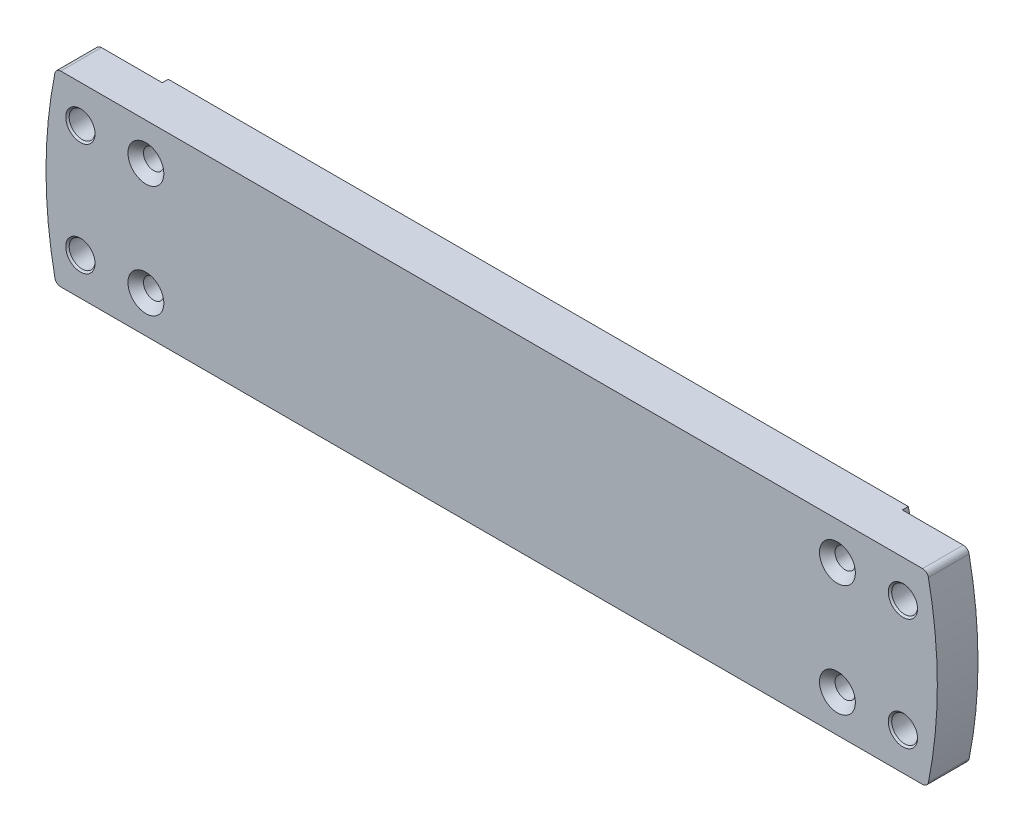
ISO-10303-21;
HEADER;
FILE_DESCRIPTION(('STEP AP214'),'2;1');
FILE_NAME('part.step','',(''),(''),'','','');
FILE_SCHEMA(('AUTOMOTIVE_DESIGN { 1 0 10303 214 1 1 1 1 }'));
ENDSEC;
DATA;
#1=APPLICATION_CONTEXT('core data for automotive mechanical design processes');
#2=APPLICATION_PROTOCOL_DEFINITION('international standard','automotive_design',2000,#1);
#3=PRODUCT_CONTEXT('',#1,'mechanical');
#4=PRODUCT('Part','Part','',(#3));
#5=PRODUCT_RELATED_PRODUCT_CATEGORY('part','',(#4));
#6=PRODUCT_DEFINITION_FORMATION('','',#4);
#7=PRODUCT_DEFINITION_CONTEXT('part definition',#1,'design');
#8=PRODUCT_DEFINITION('design','',#6,#7);
#9=PRODUCT_DEFINITION_SHAPE('','',#8);
#10=(LENGTH_UNIT() NAMED_UNIT(*) SI_UNIT(.MILLI.,.METRE.));
#11=(NAMED_UNIT(*) PLANE_ANGLE_UNIT() SI_UNIT($,.RADIAN.));
#12=(NAMED_UNIT(*) SI_UNIT($,.STERADIAN.) SOLID_ANGLE_UNIT());
#13=UNCERTAINTY_MEASURE_WITH_UNIT(LENGTH_MEASURE(1.E-05),#10,'distance_accuracy_value','');
#14=(GEOMETRIC_REPRESENTATION_CONTEXT(3) GLOBAL_UNCERTAINTY_ASSIGNED_CONTEXT((#13)) GLOBAL_UNIT_ASSIGNED_CONTEXT((#10,
#11,#12)) REPRESENTATION_CONTEXT('',''));
#15=CARTESIAN_POINT('',(0.,0.,0.));
#16=DIRECTION('',(0.,0.,1.));
#17=DIRECTION('',(1.,0.,0.));
#18=AXIS2_PLACEMENT_3D('',#15,#16,#17);
#19=CARTESIAN_POINT('',(0.,0.,7.9248));
#20=DIRECTION('',(0.,0.,-1.));
#21=DIRECTION('',(-1.,0.,0.));
#22=AXIS2_PLACEMENT_3D('',#19,#20,#21);
#23=CYLINDRICAL_SURFACE('',#22,75.692);
#24=CARTESIAN_POINT('',(0.,0.,1.016));
#25=DIRECTION('',(0.,0.,1.));
#26=DIRECTION('',(1.,0.,0.));
#27=AXIS2_PLACEMENT_3D('',#24,#25,#26);
#28=CIRCLE('',#27,75.692);
#29=CARTESIAN_POINT('',(74.1784350407569,15.0611632653061,1.016));
#30=VERTEX_POINT('',#29);
#31=CARTESIAN_POINT('',(74.1784350407569,-15.0611632653061,1.016));
#32=VERTEX_POINT('',#31);
#33=EDGE_CURVE('E157',#30,#32,#28,.F.);
#34=ORIENTED_EDGE('',*,*,#33,.F.);
#35=DIRECTION('',(0.,0.,-1.));
#36=VECTOR('',#35,1.);
#37=CARTESIAN_POINT('',(74.1784350407569,15.0611632653061,7.9248));
#38=LINE('',#37,#36);
#39=CARTESIAN_POINT('',(74.1784350407569,15.0611632653061,7.9248));
#40=VERTEX_POINT('',#39);
#41=EDGE_CURVE('E11',#30,#40,#38,.F.);
#42=ORIENTED_EDGE('',*,*,#41,.T.);
#43=CARTESIAN_POINT('',(0.,0.,7.9248));
#44=DIRECTION('',(0.,0.,-1.));
#45=DIRECTION('',(1.,0.,0.));
#46=AXIS2_PLACEMENT_3D('',#43,#44,#45);
#47=CIRCLE('',#46,75.692);
#48=CARTESIAN_POINT('',(74.1784350407569,-15.0611632653061,7.9248));
#49=VERTEX_POINT('',#48);
#50=EDGE_CURVE('E352',#40,#49,#47,.T.);
#51=ORIENTED_EDGE('',*,*,#50,.T.);
#52=DIRECTION('',(0.,0.,-1.));
#53=VECTOR('',#52,1.);
#54=CARTESIAN_POINT('',(74.1784350407569,-15.0611632653061,7.9248));
#55=LINE('',#54,#53);
#56=EDGE_CURVE('E46',#49,#32,#55,.T.);
#57=ORIENTED_EDGE('',*,*,#56,.T.);
#58=EDGE_LOOP('',(#34,#42,#51,#57));
#59=FACE_BOUND('',#58,.T.);
#60=ADVANCED_FACE('F38',(#59),#23,.T.);
#61=CARTESIAN_POINT('',(74.0085349064552,15.875,7.9248));
#62=DIRECTION('',(0.,1.,0.));
#63=DIRECTION('',(0.,0.,1.));
#64=AXIS2_PLACEMENT_3D('',#61,#62,#63);
#65=PLANE('',#64);
#66=DIRECTION('',(1.,0.,0.));
#67=VECTOR('',#66,1.);
#68=CARTESIAN_POINT('',(74.0085349064552,15.875,1.016));
#69=LINE('',#68,#67);
#70=CARTESIAN_POINT('',(-73.1827513489346,15.875,1.016));
#71=VERTEX_POINT('',#70);
#72=CARTESIAN_POINT('',(-62.8468017296027,15.875,1.016));
#73=VERTEX_POINT('',#72);
#74=EDGE_CURVE('E159',#71,#73,#69,.T.);
#75=ORIENTED_EDGE('',*,*,#74,.F.);
#76=DIRECTION('',(0.,0.,-1.));
#77=VECTOR('',#76,1.);
#78=CARTESIAN_POINT('',(-73.1827513489346,15.875,7.9248));
#79=LINE('',#78,#77);
#80=CARTESIAN_POINT('',(-73.1827513489346,15.875,7.9248));
#81=VERTEX_POINT('',#80);
#82=EDGE_CURVE('E332',#71,#81,#79,.F.);
#83=ORIENTED_EDGE('',*,*,#82,.T.);
#84=DIRECTION('',(1.,0.,0.));
#85=VECTOR('',#84,1.);
#86=CARTESIAN_POINT('',(74.0085349064552,15.875,7.9248));
#87=LINE('',#86,#85);
#88=CARTESIAN_POINT('',(73.1827513489346,15.875,7.9248));
#89=VERTEX_POINT('',#88);
#90=EDGE_CURVE('E318',#81,#89,#87,.T.);
#91=ORIENTED_EDGE('',*,*,#90,.T.);
#92=DIRECTION('',(0.,0.,-1.));
#93=VECTOR('',#92,1.);
#94=CARTESIAN_POINT('',(73.1827513489346,15.875,7.9248));
#95=LINE('',#94,#93);
#96=CARTESIAN_POINT('',(73.1827513489346,15.875,1.016));
#97=VERTEX_POINT('',#96);
#98=EDGE_CURVE('E155',#89,#97,#95,.T.);
#99=ORIENTED_EDGE('',*,*,#98,.T.);
#100=CARTESIAN_POINT('',(62.8468017296027,15.875,1.016));
#101=VERTEX_POINT('',#100);
#102=EDGE_CURVE('E143',#101,#97,#69,.T.);
#103=ORIENTED_EDGE('',*,*,#102,.F.);
#104=DIRECTION('',(0.,0.,1.));
#105=VECTOR('',#104,1.);
#106=CARTESIAN_POINT('',(62.8468017296027,15.875,-12.484857720608));
#107=LINE('',#106,#105);
#108=CARTESIAN_POINT('',(62.8468017296027,15.875,0.));
#109=VERTEX_POINT('',#108);
#110=EDGE_CURVE('E128',#109,#101,#107,.T.);
#111=ORIENTED_EDGE('',*,*,#110,.F.);
#112=DIRECTION('',(1.,0.,0.));
#113=VECTOR('',#112,1.);
#114=CARTESIAN_POINT('',(74.0085349064552,15.875,0.));
#115=LINE('',#114,#113);
#116=CARTESIAN_POINT('',(-62.8468017296027,15.875,0.));
#117=VERTEX_POINT('',#116);
#118=EDGE_CURVE('E161',#117,#109,#115,.T.);
#119=ORIENTED_EDGE('',*,*,#118,.F.);
#120=DIRECTION('',(0.,0.,1.));
#121=VECTOR('',#120,1.);
#122=CARTESIAN_POINT('',(-62.8468017296027,15.875,-12.484857720608));
#123=LINE('',#122,#121);
#124=EDGE_CURVE('E170',#73,#117,#123,.F.);
#125=ORIENTED_EDGE('',*,*,#124,.F.);
#126=EDGE_LOOP('',(#75,#83,#91,#99,#103,#111,#119,#125));
#127=FACE_BOUND('',#126,.T.);
#128=ADVANCED_FACE('F152',(#127),#65,.T.);
#129=CARTESIAN_POINT('',(0.,0.,7.9248));
#130=DIRECTION('',(0.,0.,-1.));
#131=DIRECTION('',(-1.,0.,0.));
#132=AXIS2_PLACEMENT_3D('',#129,#130,#131);
#133=CYLINDRICAL_SURFACE('',#132,75.692);
#134=CARTESIAN_POINT('',(0.,0.,7.9248));
#135=DIRECTION('',(0.,0.,-1.));
#136=DIRECTION('',(-1.,0.,0.));
#137=AXIS2_PLACEMENT_3D('',#134,#135,#136);
#138=CIRCLE('',#137,75.692);
#139=CARTESIAN_POINT('',(-74.1784350407569,-15.0611632653061,7.9248));
#140=VERTEX_POINT('',#139);
#141=CARTESIAN_POINT('',(-74.1784350407569,15.0611632653061,7.9248));
#142=VERTEX_POINT('',#141);
#143=EDGE_CURVE('E326',#140,#142,#138,.T.);
#144=ORIENTED_EDGE('',*,*,#143,.T.);
#145=DIRECTION('',(0.,0.,-1.));
#146=VECTOR('',#145,1.);
#147=CARTESIAN_POINT('',(-74.1784350407569,15.0611632653061,7.9248));
#148=LINE('',#147,#146);
#149=CARTESIAN_POINT('',(-74.1784350407569,15.0611632653061,1.016));
#150=VERTEX_POINT('',#149);
#151=EDGE_CURVE('E334',#142,#150,#148,.T.);
#152=ORIENTED_EDGE('',*,*,#151,.T.);
#153=CARTESIAN_POINT('',(0.,0.,1.016));
#154=DIRECTION('',(0.,0.,1.));
#155=DIRECTION('',(1.,0.,0.));
#156=AXIS2_PLACEMENT_3D('',#153,#154,#155);
#157=CIRCLE('',#156,75.692);
#158=CARTESIAN_POINT('',(-74.1784350407569,-15.0611632653061,1.016));
#159=VERTEX_POINT('',#158);
#160=EDGE_CURVE('E165',#159,#150,#157,.F.);
#161=ORIENTED_EDGE('',*,*,#160,.F.);
#162=DIRECTION('',(0.,0.,-1.));
#163=VECTOR('',#162,1.);
#164=CARTESIAN_POINT('',(-74.1784350407569,-15.0611632653061,7.9248));
#165=LINE('',#164,#163);
#166=EDGE_CURVE('E358',#159,#140,#165,.F.);
#167=ORIENTED_EDGE('',*,*,#166,.T.);
#168=EDGE_LOOP('',(#144,#152,#161,#167));
#169=FACE_BOUND('',#168,.T.);
#170=ADVANCED_FACE('F443',(#169),#133,.T.);
#171=CARTESIAN_POINT('',(74.0085349064552,-15.875,7.9248));
#172=DIRECTION('',(0.,-1.,0.));
#173=DIRECTION('',(0.,0.,-1.));
#174=AXIS2_PLACEMENT_3D('',#171,#172,#173);
#175=PLANE('',#174);
#176=DIRECTION('',(-1.,0.,0.));
#177=VECTOR('',#176,1.);
#178=CARTESIAN_POINT('',(74.0085349064552,-15.875,7.9248));
#179=LINE('',#178,#177);
#180=CARTESIAN_POINT('',(73.1827513489346,-15.875,7.9248));
#181=VERTEX_POINT('',#180);
#182=CARTESIAN_POINT('',(-73.1827513489346,-15.875,7.9248));
#183=VERTEX_POINT('',#182);
#184=EDGE_CURVE('E384',#181,#183,#179,.T.);
#185=ORIENTED_EDGE('',*,*,#184,.T.);
#186=DIRECTION('',(0.,0.,-1.));
#187=VECTOR('',#186,1.);
#188=CARTESIAN_POINT('',(-73.1827513489346,-15.875,7.9248));
#189=LINE('',#188,#187);
#190=CARTESIAN_POINT('',(-73.1827513489346,-15.875,1.016));
#191=VERTEX_POINT('',#190);
#192=EDGE_CURVE('E341',#183,#191,#189,.T.);
#193=ORIENTED_EDGE('',*,*,#192,.T.);
#194=DIRECTION('',(-1.,0.,0.));
#195=VECTOR('',#194,1.);
#196=CARTESIAN_POINT('',(74.0085349064552,-15.875,1.016));
#197=LINE('',#196,#195);
#198=CARTESIAN_POINT('',(-62.8468017296028,-15.875,1.016));
#199=VERTEX_POINT('',#198);
#200=EDGE_CURVE('E359',#199,#191,#197,.T.);
#201=ORIENTED_EDGE('',*,*,#200,.F.);
#202=DIRECTION('',(0.,0.,1.));
#203=VECTOR('',#202,1.);
#204=CARTESIAN_POINT('',(-62.8468017296028,-15.875,-12.484857720608));
#205=LINE('',#204,#203);
#206=CARTESIAN_POINT('',(-62.8468017296028,-15.875,0.));
#207=VERTEX_POINT('',#206);
#208=EDGE_CURVE('E139',#207,#199,#205,.T.);
#209=ORIENTED_EDGE('',*,*,#208,.F.);
#210=DIRECTION('',(-1.,0.,0.));
#211=VECTOR('',#210,1.);
#212=CARTESIAN_POINT('',(74.0085349064552,-15.875,0.));
#213=LINE('',#212,#211);
#214=CARTESIAN_POINT('',(62.8468017296028,-15.875,0.));
#215=VERTEX_POINT('',#214);
#216=EDGE_CURVE('E156',#215,#207,#213,.T.);
#217=ORIENTED_EDGE('',*,*,#216,.F.);
#218=DIRECTION('',(0.,0.,1.));
#219=VECTOR('',#218,1.);
#220=CARTESIAN_POINT('',(62.8468017296028,-15.875,-12.484857720608));
#221=LINE('',#220,#219);
#222=CARTESIAN_POINT('',(62.8468017296028,-15.875,1.016));
#223=VERTEX_POINT('',#222);
#224=EDGE_CURVE('E140',#223,#215,#221,.F.);
#225=ORIENTED_EDGE('',*,*,#224,.F.);
#226=CARTESIAN_POINT('',(73.1827513489346,-15.875,1.016));
#227=VERTEX_POINT('',#226);
#228=EDGE_CURVE('E145',#227,#223,#197,.T.);
#229=ORIENTED_EDGE('',*,*,#228,.F.);
#230=DIRECTION('',(0.,0.,-1.));
#231=VECTOR('',#230,1.);
#232=CARTESIAN_POINT('',(73.1827513489346,-15.875,7.9248));
#233=LINE('',#232,#231);
#234=EDGE_CURVE('E336',#227,#181,#233,.F.);
#235=ORIENTED_EDGE('',*,*,#234,.T.);
#236=EDGE_LOOP('',(#185,#193,#201,#209,#217,#225,#229,#235));
#237=FACE_BOUND('',#236,.T.);
#238=ADVANCED_FACE('F301',(#237),#175,.T.);
#239=CARTESIAN_POINT('',(0.,0.,7.9248));
#240=DIRECTION('',(0.,0.,1.));
#241=DIRECTION('',(1.,0.,0.));
#242=AXIS2_PLACEMENT_3D('',#239,#240,#241);
#243=PLANE('',#242);
#244=CARTESIAN_POINT('',(69.85,9.525,7.9248));
#245=DIRECTION('',(0.,0.,1.));
#246=DIRECTION('',(1.,0.,0.));
#247=AXIS2_PLACEMENT_3D('',#244,#245,#246);
#248=CIRCLE('',#247,2.4892);
#249=CARTESIAN_POINT('',(72.3392,9.525,7.9248));
#250=VERTEX_POINT('',#249);
#251=EDGE_CURVE('E269',#250,#250,#248,.T.);
#252=ORIENTED_EDGE('',*,*,#251,.F.);
#253=EDGE_LOOP('',(#252));
#254=FACE_BOUND('',#253,.T.);
#255=CARTESIAN_POINT('',(69.85,-9.525,7.9248));
#256=DIRECTION('',(0.,0.,1.));
#257=DIRECTION('',(1.,0.,0.));
#258=AXIS2_PLACEMENT_3D('',#255,#256,#257);
#259=CIRCLE('',#258,2.4892);
#260=CARTESIAN_POINT('',(72.3392,-9.525,7.9248));
#261=VERTEX_POINT('',#260);
#262=EDGE_CURVE('E257',#261,#261,#259,.T.);
#263=ORIENTED_EDGE('',*,*,#262,.F.);
#264=EDGE_LOOP('',(#263));
#265=FACE_BOUND('',#264,.T.);
#266=CARTESIAN_POINT('',(-69.85,9.525,7.9248));
#267=DIRECTION('',(0.,0.,1.));
#268=DIRECTION('',(1.,0.,0.));
#269=AXIS2_PLACEMENT_3D('',#266,#267,#268);
#270=CIRCLE('',#269,2.4892);
#271=CARTESIAN_POINT('',(-67.3608,9.525,7.9248));
#272=VERTEX_POINT('',#271);
#273=EDGE_CURVE('E245',#272,#272,#270,.T.);
#274=ORIENTED_EDGE('',*,*,#273,.F.);
#275=EDGE_LOOP('',(#274));
#276=FACE_BOUND('',#275,.T.);
#277=CARTESIAN_POINT('',(-69.85,-9.525,7.9248));
#278=DIRECTION('',(0.,0.,1.));
#279=DIRECTION('',(1.,0.,0.));
#280=AXIS2_PLACEMENT_3D('',#277,#278,#279);
#281=CIRCLE('',#280,2.4892);
#282=CARTESIAN_POINT('',(-67.3608,-9.525,7.9248));
#283=VERTEX_POINT('',#282);
#284=EDGE_CURVE('E233',#283,#283,#281,.T.);
#285=ORIENTED_EDGE('',*,*,#284,.F.);
#286=EDGE_LOOP('',(#285));
#287=FACE_BOUND('',#286,.T.);
#288=CARTESIAN_POINT('',(-58.7248,9.525,7.9248));
#289=DIRECTION('',(0.,0.,-1.));
#290=DIRECTION('',(-1.,0.,0.));
#291=AXIS2_PLACEMENT_3D('',#288,#289,#290);
#292=CIRCLE('',#291,3.048);
#293=CARTESIAN_POINT('',(-61.7728,9.525,7.9248));
#294=VERTEX_POINT('',#293);
#295=EDGE_CURVE('E224',#294,#294,#292,.T.);
#296=ORIENTED_EDGE('',*,*,#295,.T.);
#297=EDGE_LOOP('',(#296));
#298=FACE_BOUND('',#297,.T.);
#299=CARTESIAN_POINT('',(-58.7248,-9.525,7.9248));
#300=DIRECTION('',(0.,0.,-1.));
#301=DIRECTION('',(-1.,0.,0.));
#302=AXIS2_PLACEMENT_3D('',#299,#300,#301);
#303=CIRCLE('',#302,3.048);
#304=CARTESIAN_POINT('',(-61.7728,-9.525,7.9248));
#305=VERTEX_POINT('',#304);
#306=EDGE_CURVE('E211',#305,#305,#303,.T.);
#307=ORIENTED_EDGE('',*,*,#306,.T.);
#308=EDGE_LOOP('',(#307));
#309=FACE_BOUND('',#308,.T.);
#310=CARTESIAN_POINT('',(58.7248,9.525,7.9248));
#311=DIRECTION('',(0.,0.,-1.));
#312=DIRECTION('',(-1.,0.,0.));
#313=AXIS2_PLACEMENT_3D('',#310,#311,#312);
#314=CIRCLE('',#313,3.048);
#315=CARTESIAN_POINT('',(55.6768,9.525,7.9248));
#316=VERTEX_POINT('',#315);
#317=EDGE_CURVE('E198',#316,#316,#314,.T.);
#318=ORIENTED_EDGE('',*,*,#317,.T.);
#319=EDGE_LOOP('',(#318));
#320=FACE_BOUND('',#319,.T.);
#321=CARTESIAN_POINT('',(58.7248,-9.525,7.9248));
#322=DIRECTION('',(0.,0.,-1.));
#323=DIRECTION('',(-1.,0.,0.));
#324=AXIS2_PLACEMENT_3D('',#321,#322,#323);
#325=CIRCLE('',#324,3.048);
#326=CARTESIAN_POINT('',(55.6768,-9.525,7.9248));
#327=VERTEX_POINT('',#326);
#328=EDGE_CURVE('E185',#327,#327,#325,.T.);
#329=ORIENTED_EDGE('',*,*,#328,.T.);
#330=EDGE_LOOP('',(#329));
#331=FACE_BOUND('',#330,.T.);
#332=ORIENTED_EDGE('',*,*,#90,.F.);
#333=CARTESIAN_POINT('',(-73.1827513489346,14.859,7.9248));
#334=DIRECTION('',(0.,0.,1.));
#335=DIRECTION('',(1.,0.,0.));
#336=AXIS2_PLACEMENT_3D('',#333,#334,#335);
#337=CIRCLE('',#336,1.016);
#338=EDGE_CURVE('E321',#81,#142,#337,.T.);
#339=ORIENTED_EDGE('',*,*,#338,.T.);
#340=ORIENTED_EDGE('',*,*,#143,.F.);
#341=CARTESIAN_POINT('',(-73.1827513489346,-14.859,7.9248));
#342=DIRECTION('',(0.,0.,1.));
#343=DIRECTION('',(1.,0.,0.));
#344=AXIS2_PLACEMENT_3D('',#341,#342,#343);
#345=CIRCLE('',#344,1.016);
#346=EDGE_CURVE('E337',#140,#183,#345,.T.);
#347=ORIENTED_EDGE('',*,*,#346,.T.);
#348=ORIENTED_EDGE('',*,*,#184,.F.);
#349=CARTESIAN_POINT('',(73.1827513489346,-14.859,7.9248));
#350=DIRECTION('',(0.,0.,1.));
#351=DIRECTION('',(1.,0.,0.));
#352=AXIS2_PLACEMENT_3D('',#349,#350,#351);
#353=CIRCLE('',#352,1.016);
#354=EDGE_CURVE('E361',#181,#49,#353,.T.);
#355=ORIENTED_EDGE('',*,*,#354,.T.);
#356=ORIENTED_EDGE('',*,*,#50,.F.);
#357=CARTESIAN_POINT('',(73.1827513489346,14.859,7.9248));
#358=DIRECTION('',(0.,0.,1.));
#359=DIRECTION('',(1.,0.,0.));
#360=AXIS2_PLACEMENT_3D('',#357,#358,#359);
#361=CIRCLE('',#360,1.016);
#362=EDGE_CURVE('E325',#40,#89,#361,.T.);
#363=ORIENTED_EDGE('',*,*,#362,.T.);
#364=EDGE_LOOP('',(#332,#339,#340,#347,#348,#355,#356,#363));
#365=FACE_BOUND('',#364,.T.);
#366=ADVANCED_FACE('F297',(#254,#265,#276,#287,#298,#309,#320,#331,#365),#243,.T.);
#367=CARTESIAN_POINT('',(0.,0.,0.));
#368=DIRECTION('',(0.,0.,1.));
#369=DIRECTION('',(1.,0.,0.));
#370=AXIS2_PLACEMENT_3D('',#367,#368,#369);
#371=PLANE('',#370);
#372=CARTESIAN_POINT('',(-58.7248,9.525,0.));
#373=DIRECTION('',(0.,0.,-1.));
#374=DIRECTION('',(-1.,0.,0.));
#375=AXIS2_PLACEMENT_3D('',#372,#373,#374);
#376=CIRCLE('',#375,2.286);
#377=CARTESIAN_POINT('',(-61.0108,9.525,0.));
#378=VERTEX_POINT('',#377);
#379=EDGE_CURVE('E220',#378,#378,#376,.T.);
#380=ORIENTED_EDGE('',*,*,#379,.F.);
#381=EDGE_LOOP('',(#380));
#382=FACE_BOUND('',#381,.T.);
#383=CARTESIAN_POINT('',(-58.7248,-9.525,0.));
#384=DIRECTION('',(0.,0.,-1.));
#385=DIRECTION('',(-1.,0.,0.));
#386=AXIS2_PLACEMENT_3D('',#383,#384,#385);
#387=CIRCLE('',#386,2.286);
#388=CARTESIAN_POINT('',(-61.0108,-9.525,0.));
#389=VERTEX_POINT('',#388);
#390=EDGE_CURVE('E207',#389,#389,#387,.T.);
#391=ORIENTED_EDGE('',*,*,#390,.F.);
#392=EDGE_LOOP('',(#391));
#393=FACE_BOUND('',#392,.T.);
#394=CARTESIAN_POINT('',(58.7248,9.525,0.));
#395=DIRECTION('',(0.,0.,-1.));
#396=DIRECTION('',(-1.,0.,0.));
#397=AXIS2_PLACEMENT_3D('',#394,#395,#396);
#398=CIRCLE('',#397,2.286);
#399=CARTESIAN_POINT('',(56.4388,9.525,0.));
#400=VERTEX_POINT('',#399);
#401=EDGE_CURVE('E194',#400,#400,#398,.T.);
#402=ORIENTED_EDGE('',*,*,#401,.F.);
#403=EDGE_LOOP('',(#402));
#404=FACE_BOUND('',#403,.T.);
#405=CARTESIAN_POINT('',(58.7248,-9.525,0.));
#406=DIRECTION('',(0.,0.,-1.));
#407=DIRECTION('',(-1.,0.,0.));
#408=AXIS2_PLACEMENT_3D('',#405,#406,#407);
#409=CIRCLE('',#408,2.286);
#410=CARTESIAN_POINT('',(56.4388,-9.525,0.));
#411=VERTEX_POINT('',#410);
#412=EDGE_CURVE('E181',#411,#411,#409,.T.);
#413=ORIENTED_EDGE('',*,*,#412,.F.);
#414=EDGE_LOOP('',(#413));
#415=FACE_BOUND('',#414,.T.);
#416=ORIENTED_EDGE('',*,*,#216,.T.);
#417=CARTESIAN_POINT('',(0.,0.,0.));
#418=DIRECTION('',(0.,0.,1.));
#419=DIRECTION('',(1.,0.,0.));
#420=AXIS2_PLACEMENT_3D('',#417,#418,#419);
#421=CIRCLE('',#420,64.8208);
#422=EDGE_CURVE('E377',#207,#117,#421,.F.);
#423=ORIENTED_EDGE('',*,*,#422,.T.);
#424=ORIENTED_EDGE('',*,*,#118,.T.);
#425=EDGE_CURVE('E134',#109,#215,#421,.F.);
#426=ORIENTED_EDGE('',*,*,#425,.T.);
#427=EDGE_LOOP('',(#416,#423,#424,#426));
#428=FACE_BOUND('',#427,.T.);
#429=ADVANCED_FACE('F300',(#382,#393,#404,#415,#428),#371,.F.);
#430=CARTESIAN_POINT('',(0.,0.,-12.484857720608));
#431=DIRECTION('',(0.,0.,1.));
#432=DIRECTION('',(1.,0.,0.));
#433=AXIS2_PLACEMENT_3D('',#430,#431,#432);
#434=CYLINDRICAL_SURFACE('',#433,64.8208);
#435=ORIENTED_EDGE('',*,*,#110,.T.);
#436=CARTESIAN_POINT('',(0.,0.,1.016));
#437=DIRECTION('',(0.,0.,1.));
#438=DIRECTION('',(1.,0.,0.));
#439=AXIS2_PLACEMENT_3D('',#436,#437,#438);
#440=CIRCLE('',#439,64.8208);
#441=EDGE_CURVE('E131',#223,#101,#440,.T.);
#442=ORIENTED_EDGE('',*,*,#441,.F.);
#443=ORIENTED_EDGE('',*,*,#224,.T.);
#444=ORIENTED_EDGE('',*,*,#425,.F.);
#445=EDGE_LOOP('',(#435,#442,#443,#444));
#446=FACE_BOUND('',#445,.T.);
#447=ADVANCED_FACE('F130',(#446),#434,.T.);
#448=CARTESIAN_POINT('',(64.8208,0.,1.016));
#449=DIRECTION('',(0.,0.,1.));
#450=DIRECTION('',(1.,0.,0.));
#451=AXIS2_PLACEMENT_3D('',#448,#449,#450);
#452=PLANE('',#451);
#453=CARTESIAN_POINT('',(69.85,9.525,1.016));
#454=DIRECTION('',(0.,0.,1.));
#455=DIRECTION('',(1.,0.,0.));
#456=AXIS2_PLACEMENT_3D('',#453,#454,#455);
#457=CIRCLE('',#456,2.4892);
#458=CARTESIAN_POINT('',(72.3392,9.525,1.016));
#459=VERTEX_POINT('',#458);
#460=EDGE_CURVE('E272',#459,#459,#457,.T.);
#461=ORIENTED_EDGE('',*,*,#460,.T.);
#462=EDGE_LOOP('',(#461));
#463=FACE_BOUND('',#462,.T.);
#464=CARTESIAN_POINT('',(69.85,-9.525,1.016));
#465=DIRECTION('',(0.,0.,1.));
#466=DIRECTION('',(1.,0.,0.));
#467=AXIS2_PLACEMENT_3D('',#464,#465,#466);
#468=CIRCLE('',#467,2.4892);
#469=CARTESIAN_POINT('',(72.3392,-9.525,1.016));
#470=VERTEX_POINT('',#469);
#471=EDGE_CURVE('E260',#470,#470,#468,.T.);
#472=ORIENTED_EDGE('',*,*,#471,.T.);
#473=EDGE_LOOP('',(#472));
#474=FACE_BOUND('',#473,.T.);
#475=ORIENTED_EDGE('',*,*,#102,.T.);
#476=CARTESIAN_POINT('',(73.1827513489346,14.859,1.016));
#477=DIRECTION('',(0.,0.,1.));
#478=DIRECTION('',(1.,0.,0.));
#479=AXIS2_PLACEMENT_3D('',#476,#477,#478);
#480=CIRCLE('',#479,1.016);
#481=EDGE_CURVE('E61',#97,#30,#480,.F.);
#482=ORIENTED_EDGE('',*,*,#481,.T.);
#483=ORIENTED_EDGE('',*,*,#33,.T.);
#484=CARTESIAN_POINT('',(73.1827513489346,-14.859,1.016));
#485=DIRECTION('',(0.,0.,1.));
#486=DIRECTION('',(1.,0.,0.));
#487=AXIS2_PLACEMENT_3D('',#484,#485,#486);
#488=CIRCLE('',#487,1.016);
#489=EDGE_CURVE('E53',#32,#227,#488,.F.);
#490=ORIENTED_EDGE('',*,*,#489,.T.);
#491=ORIENTED_EDGE('',*,*,#228,.T.);
#492=ORIENTED_EDGE('',*,*,#441,.T.);
#493=EDGE_LOOP('',(#475,#482,#483,#490,#491,#492));
#494=FACE_BOUND('',#493,.T.);
#495=ADVANCED_FACE('F142',(#463,#474,#494),#452,.F.);
#496=ORIENTED_EDGE('',*,*,#124,.T.);
#497=ORIENTED_EDGE('',*,*,#422,.F.);
#498=ORIENTED_EDGE('',*,*,#208,.T.);
#499=EDGE_CURVE('E147',#73,#199,#440,.T.);
#500=ORIENTED_EDGE('',*,*,#499,.F.);
#501=EDGE_LOOP('',(#496,#497,#498,#500));
#502=FACE_BOUND('',#501,.T.);
#503=ADVANCED_FACE('F404',(#502),#434,.T.);
#504=CARTESIAN_POINT('',(-69.85,9.525,1.016));
#505=DIRECTION('',(0.,0.,1.));
#506=DIRECTION('',(1.,0.,0.));
#507=AXIS2_PLACEMENT_3D('',#504,#505,#506);
#508=CIRCLE('',#507,2.4892);
#509=CARTESIAN_POINT('',(-67.3608,9.525,1.016));
#510=VERTEX_POINT('',#509);
#511=EDGE_CURVE('E248',#510,#510,#508,.T.);
#512=ORIENTED_EDGE('',*,*,#511,.T.);
#513=EDGE_LOOP('',(#512));
#514=FACE_BOUND('',#513,.T.);
#515=CARTESIAN_POINT('',(-69.85,-9.525,1.016));
#516=DIRECTION('',(0.,0.,1.));
#517=DIRECTION('',(1.,0.,0.));
#518=AXIS2_PLACEMENT_3D('',#515,#516,#517);
#519=CIRCLE('',#518,2.4892);
#520=CARTESIAN_POINT('',(-67.3608,-9.525,1.016));
#521=VERTEX_POINT('',#520);
#522=EDGE_CURVE('E236',#521,#521,#519,.T.);
#523=ORIENTED_EDGE('',*,*,#522,.T.);
#524=EDGE_LOOP('',(#523));
#525=FACE_BOUND('',#524,.T.);
#526=ORIENTED_EDGE('',*,*,#160,.T.);
#527=CARTESIAN_POINT('',(-73.1827513489346,14.859,1.016));
#528=DIRECTION('',(0.,0.,1.));
#529=DIRECTION('',(1.,0.,0.));
#530=AXIS2_PLACEMENT_3D('',#527,#528,#529);
#531=CIRCLE('',#530,1.016);
#532=EDGE_CURVE('E370',#150,#71,#531,.F.);
#533=ORIENTED_EDGE('',*,*,#532,.T.);
#534=ORIENTED_EDGE('',*,*,#74,.T.);
#535=ORIENTED_EDGE('',*,*,#499,.T.);
#536=ORIENTED_EDGE('',*,*,#200,.T.);
#537=CARTESIAN_POINT('',(-73.1827513489346,-14.859,1.016));
#538=DIRECTION('',(0.,0.,1.));
#539=DIRECTION('',(1.,0.,0.));
#540=AXIS2_PLACEMENT_3D('',#537,#538,#539);
#541=CIRCLE('',#540,1.016);
#542=EDGE_CURVE('E372',#191,#159,#541,.F.);
#543=ORIENTED_EDGE('',*,*,#542,.T.);
#544=EDGE_LOOP('',(#526,#533,#534,#535,#536,#543));
#545=FACE_BOUND('',#544,.T.);
#546=ADVANCED_FACE('F406',(#514,#525,#545),#452,.F.);
#547=CARTESIAN_POINT('',(-73.1827513489346,14.859,7.9248));
#548=DIRECTION('',(0.,0.,-1.));
#549=DIRECTION('',(-1.,0.,0.));
#550=AXIS2_PLACEMENT_3D('',#547,#548,#549);
#551=CYLINDRICAL_SURFACE('',#550,1.016);
#552=ORIENTED_EDGE('',*,*,#338,.F.);
#553=ORIENTED_EDGE('',*,*,#82,.F.);
#554=ORIENTED_EDGE('',*,*,#532,.F.);
#555=ORIENTED_EDGE('',*,*,#151,.F.);
#556=EDGE_LOOP('',(#552,#553,#554,#555));
#557=FACE_BOUND('',#556,.T.);
#558=ADVANCED_FACE('F331',(#557),#551,.T.);
#559=CARTESIAN_POINT('',(-73.1827513489346,-14.859,7.9248));
#560=DIRECTION('',(0.,0.,-1.));
#561=DIRECTION('',(-1.,0.,0.));
#562=AXIS2_PLACEMENT_3D('',#559,#560,#561);
#563=CYLINDRICAL_SURFACE('',#562,1.016);
#564=ORIENTED_EDGE('',*,*,#346,.F.);
#565=ORIENTED_EDGE('',*,*,#166,.F.);
#566=ORIENTED_EDGE('',*,*,#542,.F.);
#567=ORIENTED_EDGE('',*,*,#192,.F.);
#568=EDGE_LOOP('',(#564,#565,#566,#567));
#569=FACE_BOUND('',#568,.T.);
#570=ADVANCED_FACE('F440',(#569),#563,.T.);
#571=CARTESIAN_POINT('',(73.1827513489346,14.859,7.9248));
#572=DIRECTION('',(0.,0.,-1.));
#573=DIRECTION('',(-1.,0.,0.));
#574=AXIS2_PLACEMENT_3D('',#571,#572,#573);
#575=CYLINDRICAL_SURFACE('',#574,1.016);
#576=ORIENTED_EDGE('',*,*,#362,.F.);
#577=ORIENTED_EDGE('',*,*,#41,.F.);
#578=ORIENTED_EDGE('',*,*,#481,.F.);
#579=ORIENTED_EDGE('',*,*,#98,.F.);
#580=EDGE_LOOP('',(#576,#577,#578,#579));
#581=FACE_BOUND('',#580,.T.);
#582=ADVANCED_FACE('F459',(#581),#575,.T.);
#583=CARTESIAN_POINT('',(73.1827513489346,-14.859,7.9248));
#584=DIRECTION('',(0.,0.,-1.));
#585=DIRECTION('',(-1.,0.,0.));
#586=AXIS2_PLACEMENT_3D('',#583,#584,#585);
#587=CYLINDRICAL_SURFACE('',#586,1.016);
#588=ORIENTED_EDGE('',*,*,#354,.F.);
#589=ORIENTED_EDGE('',*,*,#234,.F.);
#590=ORIENTED_EDGE('',*,*,#489,.F.);
#591=ORIENTED_EDGE('',*,*,#56,.F.);
#592=EDGE_LOOP('',(#588,#589,#590,#591));
#593=FACE_BOUND('',#592,.T.);
#594=ADVANCED_FACE('F40',(#593),#587,.T.);
#595=CARTESIAN_POINT('',(58.7248,-9.525,6.604));
#596=DIRECTION('',(0.,0.,1.));
#597=DIRECTION('',(1.,0.,0.));
#598=AXIS2_PLACEMENT_3D('',#595,#596,#597);
#599=CONICAL_SURFACE('',#598,1.7272,0.785398163397446);
#600=ORIENTED_EDGE('',*,*,#328,.F.);
#601=EDGE_LOOP('',(#600));
#602=FACE_BOUND('',#601,.T.);
#603=CARTESIAN_POINT('',(58.7248,-9.525,6.604));
#604=DIRECTION('',(0.,0.,-1.));
#605=DIRECTION('',(-1.,0.,0.));
#606=AXIS2_PLACEMENT_3D('',#603,#604,#605);
#607=CIRCLE('',#606,1.7272);
#608=CARTESIAN_POINT('',(56.9976,-9.525,6.604));
#609=VERTEX_POINT('',#608);
#610=EDGE_CURVE('E148',#609,#609,#607,.T.);
#611=ORIENTED_EDGE('',*,*,#610,.T.);
#612=EDGE_LOOP('',(#611));
#613=FACE_BOUND('',#612,.T.);
#614=ADVANCED_FACE('F465',(#602,#613),#599,.F.);
#615=CARTESIAN_POINT('',(58.7248,-9.525,0.));
#616=DIRECTION('',(0.,0.,-1.));
#617=DIRECTION('',(-1.,0.,0.));
#618=AXIS2_PLACEMENT_3D('',#615,#616,#617);
#619=CYLINDRICAL_SURFACE('',#618,1.7272);
#620=ORIENTED_EDGE('',*,*,#610,.F.);
#621=EDGE_LOOP('',(#620));
#622=FACE_BOUND('',#621,.T.);
#623=CARTESIAN_POINT('',(58.7248,-9.525,0.558800000000001));
#624=DIRECTION('',(0.,0.,-1.));
#625=DIRECTION('',(-1.,0.,0.));
#626=AXIS2_PLACEMENT_3D('',#623,#624,#625);
#627=CIRCLE('',#626,1.7272);
#628=CARTESIAN_POINT('',(56.9976,-9.525,0.558800000000001));
#629=VERTEX_POINT('',#628);
#630=EDGE_CURVE('E178',#629,#629,#627,.T.);
#631=ORIENTED_EDGE('',*,*,#630,.T.);
#632=EDGE_LOOP('',(#631));
#633=FACE_BOUND('',#632,.T.);
#634=ADVANCED_FACE('F468',(#622,#633),#619,.F.);
#635=CARTESIAN_POINT('',(58.7248,-9.525,0.));
#636=DIRECTION('',(0.,0.,-1.));
#637=DIRECTION('',(-1.,0.,0.));
#638=AXIS2_PLACEMENT_3D('',#635,#636,#637);
#639=CONICAL_SURFACE('',#638,2.286,0.785398163397452);
#640=ORIENTED_EDGE('',*,*,#630,.F.);
#641=EDGE_LOOP('',(#640));
#642=FACE_BOUND('',#641,.T.);
#643=ORIENTED_EDGE('',*,*,#412,.T.);
#644=EDGE_LOOP('',(#643));
#645=FACE_BOUND('',#644,.T.);
#646=ADVANCED_FACE('F473',(#642,#645),#639,.F.);
#647=CARTESIAN_POINT('',(58.7248,9.525,6.604));
#648=DIRECTION('',(0.,0.,1.));
#649=DIRECTION('',(1.,0.,0.));
#650=AXIS2_PLACEMENT_3D('',#647,#648,#649);
#651=CONICAL_SURFACE('',#650,1.7272,0.785398163397446);
#652=ORIENTED_EDGE('',*,*,#317,.F.);
#653=EDGE_LOOP('',(#652));
#654=FACE_BOUND('',#653,.T.);
#655=CARTESIAN_POINT('',(58.7248,9.525,6.604));
#656=DIRECTION('',(0.,0.,-1.));
#657=DIRECTION('',(-1.,0.,0.));
#658=AXIS2_PLACEMENT_3D('',#655,#656,#657);
#659=CIRCLE('',#658,1.7272);
#660=CARTESIAN_POINT('',(56.9976,9.525,6.604));
#661=VERTEX_POINT('',#660);
#662=EDGE_CURVE('E188',#661,#661,#659,.T.);
#663=ORIENTED_EDGE('',*,*,#662,.T.);
#664=EDGE_LOOP('',(#663));
#665=FACE_BOUND('',#664,.T.);
#666=ADVANCED_FACE('F526',(#654,#665),#651,.F.);
#667=CARTESIAN_POINT('',(58.7248,9.525,0.));
#668=DIRECTION('',(0.,0.,-1.));
#669=DIRECTION('',(-1.,0.,0.));
#670=AXIS2_PLACEMENT_3D('',#667,#668,#669);
#671=CYLINDRICAL_SURFACE('',#670,1.7272);
#672=ORIENTED_EDGE('',*,*,#662,.F.);
#673=EDGE_LOOP('',(#672));
#674=FACE_BOUND('',#673,.T.);
#675=CARTESIAN_POINT('',(58.7248,9.525,0.558800000000001));
#676=DIRECTION('',(0.,0.,-1.));
#677=DIRECTION('',(-1.,0.,0.));
#678=AXIS2_PLACEMENT_3D('',#675,#676,#677);
#679=CIRCLE('',#678,1.7272);
#680=CARTESIAN_POINT('',(56.9976,9.525,0.558800000000001));
#681=VERTEX_POINT('',#680);
#682=EDGE_CURVE('E191',#681,#681,#679,.T.);
#683=ORIENTED_EDGE('',*,*,#682,.T.);
#684=EDGE_LOOP('',(#683));
#685=FACE_BOUND('',#684,.T.);
#686=ADVANCED_FACE('F535',(#674,#685),#671,.F.);
#687=CARTESIAN_POINT('',(58.7248,9.525,0.));
#688=DIRECTION('',(0.,0.,-1.));
#689=DIRECTION('',(-1.,0.,0.));
#690=AXIS2_PLACEMENT_3D('',#687,#688,#689);
#691=CONICAL_SURFACE('',#690,2.286,0.785398163397452);
#692=ORIENTED_EDGE('',*,*,#682,.F.);
#693=EDGE_LOOP('',(#692));
#694=FACE_BOUND('',#693,.T.);
#695=ORIENTED_EDGE('',*,*,#401,.T.);
#696=EDGE_LOOP('',(#695));
#697=FACE_BOUND('',#696,.T.);
#698=ADVANCED_FACE('F544',(#694,#697),#691,.F.);
#699=CARTESIAN_POINT('',(-58.7248,-9.525,6.604));
#700=DIRECTION('',(0.,0.,1.));
#701=DIRECTION('',(1.,0.,0.));
#702=AXIS2_PLACEMENT_3D('',#699,#700,#701);
#703=CONICAL_SURFACE('',#702,1.7272,0.785398163397446);
#704=ORIENTED_EDGE('',*,*,#306,.F.);
#705=EDGE_LOOP('',(#704));
#706=FACE_BOUND('',#705,.T.);
#707=CARTESIAN_POINT('',(-58.7248,-9.525,6.604));
#708=DIRECTION('',(0.,0.,-1.));
#709=DIRECTION('',(-1.,0.,0.));
#710=AXIS2_PLACEMENT_3D('',#707,#708,#709);
#711=CIRCLE('',#710,1.7272);
#712=CARTESIAN_POINT('',(-60.452,-9.525,6.604));
#713=VERTEX_POINT('',#712);
#714=EDGE_CURVE('E201',#713,#713,#711,.T.);
#715=ORIENTED_EDGE('',*,*,#714,.T.);
#716=EDGE_LOOP('',(#715));
#717=FACE_BOUND('',#716,.T.);
#718=ADVANCED_FACE('F554',(#706,#717),#703,.F.);
#719=CARTESIAN_POINT('',(-58.7248,-9.525,0.));
#720=DIRECTION('',(0.,0.,-1.));
#721=DIRECTION('',(-1.,0.,0.));
#722=AXIS2_PLACEMENT_3D('',#719,#720,#721);
#723=CYLINDRICAL_SURFACE('',#722,1.7272);
#724=ORIENTED_EDGE('',*,*,#714,.F.);
#725=EDGE_LOOP('',(#724));
#726=FACE_BOUND('',#725,.T.);
#727=CARTESIAN_POINT('',(-58.7248,-9.525,0.558800000000001));
#728=DIRECTION('',(0.,0.,-1.));
#729=DIRECTION('',(-1.,0.,0.));
#730=AXIS2_PLACEMENT_3D('',#727,#728,#729);
#731=CIRCLE('',#730,1.7272);
#732=CARTESIAN_POINT('',(-60.452,-9.525,0.558800000000001));
#733=VERTEX_POINT('',#732);
#734=EDGE_CURVE('E204',#733,#733,#731,.T.);
#735=ORIENTED_EDGE('',*,*,#734,.T.);
#736=EDGE_LOOP('',(#735));
#737=FACE_BOUND('',#736,.T.);
#738=ADVANCED_FACE('F564',(#726,#737),#723,.F.);
#739=CARTESIAN_POINT('',(-58.7248,-9.525,0.));
#740=DIRECTION('',(0.,0.,-1.));
#741=DIRECTION('',(-1.,0.,0.));
#742=AXIS2_PLACEMENT_3D('',#739,#740,#741);
#743=CONICAL_SURFACE('',#742,2.286,0.785398163397452);
#744=ORIENTED_EDGE('',*,*,#734,.F.);
#745=EDGE_LOOP('',(#744));
#746=FACE_BOUND('',#745,.T.);
#747=ORIENTED_EDGE('',*,*,#390,.T.);
#748=EDGE_LOOP('',(#747));
#749=FACE_BOUND('',#748,.T.);
#750=ADVANCED_FACE('F573',(#746,#749),#743,.F.);
#751=CARTESIAN_POINT('',(-58.7248,9.525,6.604));
#752=DIRECTION('',(0.,0.,1.));
#753=DIRECTION('',(1.,0.,0.));
#754=AXIS2_PLACEMENT_3D('',#751,#752,#753);
#755=CONICAL_SURFACE('',#754,1.7272,0.785398163397446);
#756=ORIENTED_EDGE('',*,*,#295,.F.);
#757=EDGE_LOOP('',(#756));
#758=FACE_BOUND('',#757,.T.);
#759=CARTESIAN_POINT('',(-58.7248,9.525,6.604));
#760=DIRECTION('',(0.,0.,-1.));
#761=DIRECTION('',(-1.,0.,0.));
#762=AXIS2_PLACEMENT_3D('',#759,#760,#761);
#763=CIRCLE('',#762,1.7272);
#764=CARTESIAN_POINT('',(-60.452,9.525,6.604));
#765=VERTEX_POINT('',#764);
#766=EDGE_CURVE('E214',#765,#765,#763,.T.);
#767=ORIENTED_EDGE('',*,*,#766,.T.);
#768=EDGE_LOOP('',(#767));
#769=FACE_BOUND('',#768,.T.);
#770=ADVANCED_FACE('F583',(#758,#769),#755,.F.);
#771=CARTESIAN_POINT('',(-58.7248,9.525,0.));
#772=DIRECTION('',(0.,0.,-1.));
#773=DIRECTION('',(-1.,0.,0.));
#774=AXIS2_PLACEMENT_3D('',#771,#772,#773);
#775=CYLINDRICAL_SURFACE('',#774,1.7272);
#776=ORIENTED_EDGE('',*,*,#766,.F.);
#777=EDGE_LOOP('',(#776));
#778=FACE_BOUND('',#777,.T.);
#779=CARTESIAN_POINT('',(-58.7248,9.525,0.558800000000001));
#780=DIRECTION('',(0.,0.,-1.));
#781=DIRECTION('',(-1.,0.,0.));
#782=AXIS2_PLACEMENT_3D('',#779,#780,#781);
#783=CIRCLE('',#782,1.7272);
#784=CARTESIAN_POINT('',(-60.452,9.525,0.558800000000001));
#785=VERTEX_POINT('',#784);
#786=EDGE_CURVE('E217',#785,#785,#783,.T.);
#787=ORIENTED_EDGE('',*,*,#786,.T.);
#788=EDGE_LOOP('',(#787));
#789=FACE_BOUND('',#788,.T.);
#790=ADVANCED_FACE('F593',(#778,#789),#775,.F.);
#791=CARTESIAN_POINT('',(-58.7248,9.525,0.));
#792=DIRECTION('',(0.,0.,-1.));
#793=DIRECTION('',(-1.,0.,0.));
#794=AXIS2_PLACEMENT_3D('',#791,#792,#793);
#795=CONICAL_SURFACE('',#794,2.286,0.785398163397452);
#796=ORIENTED_EDGE('',*,*,#786,.F.);
#797=EDGE_LOOP('',(#796));
#798=FACE_BOUND('',#797,.T.);
#799=ORIENTED_EDGE('',*,*,#379,.T.);
#800=EDGE_LOOP('',(#799));
#801=FACE_BOUND('',#800,.T.);
#802=ADVANCED_FACE('F602',(#798,#801),#795,.F.);
#803=CARTESIAN_POINT('',(-69.85,-9.525,1.3081));
#804=DIRECTION('',(0.,0.,-1.));
#805=DIRECTION('',(-1.,0.,0.));
#806=AXIS2_PLACEMENT_3D('',#803,#804,#805);
#807=CONICAL_SURFACE('',#806,2.19709999999999,0.785398163397453);
#808=ORIENTED_EDGE('',*,*,#522,.F.);
#809=EDGE_LOOP('',(#808));
#810=FACE_BOUND('',#809,.T.);
#811=CARTESIAN_POINT('',(-69.85,-9.525,1.3081));
#812=DIRECTION('',(0.,0.,1.));
#813=DIRECTION('',(1.,0.,0.));
#814=AXIS2_PLACEMENT_3D('',#811,#812,#813);
#815=CIRCLE('',#814,2.19709999999999);
#816=CARTESIAN_POINT('',(-67.6529,-9.525,1.3081));
#817=VERTEX_POINT('',#816);
#818=EDGE_CURVE('E227',#817,#817,#815,.T.);
#819=ORIENTED_EDGE('',*,*,#818,.T.);
#820=EDGE_LOOP('',(#819));
#821=FACE_BOUND('',#820,.T.);
#822=ADVANCED_FACE('F611',(#810,#821),#807,.F.);
#823=CARTESIAN_POINT('',(-69.85,-9.525,7.9248));
#824=DIRECTION('',(0.,0.,1.));
#825=DIRECTION('',(1.,0.,0.));
#826=AXIS2_PLACEMENT_3D('',#823,#824,#825);
#827=CYLINDRICAL_SURFACE('',#826,2.19709999999999);
#828=ORIENTED_EDGE('',*,*,#818,.F.);
#829=EDGE_LOOP('',(#828));
#830=FACE_BOUND('',#829,.T.);
#831=CARTESIAN_POINT('',(-69.85,-9.525,7.6327));
#832=DIRECTION('',(0.,0.,1.));
#833=DIRECTION('',(1.,0.,0.));
#834=AXIS2_PLACEMENT_3D('',#831,#832,#833);
#835=CIRCLE('',#834,2.19709999999999);
#836=CARTESIAN_POINT('',(-67.6529,-9.525,7.6327));
#837=VERTEX_POINT('',#836);
#838=EDGE_CURVE('E230',#837,#837,#835,.T.);
#839=ORIENTED_EDGE('',*,*,#838,.T.);
#840=EDGE_LOOP('',(#839));
#841=FACE_BOUND('',#840,.T.);
#842=ADVANCED_FACE('F620',(#830,#841),#827,.F.);
#843=CARTESIAN_POINT('',(-69.85,-9.525,7.9248));
#844=DIRECTION('',(0.,0.,1.));
#845=DIRECTION('',(1.,0.,0.));
#846=AXIS2_PLACEMENT_3D('',#843,#844,#845);
#847=CONICAL_SURFACE('',#846,2.4892,0.785398163397453);
#848=ORIENTED_EDGE('',*,*,#838,.F.);
#849=EDGE_LOOP('',(#848));
#850=FACE_BOUND('',#849,.T.);
#851=ORIENTED_EDGE('',*,*,#284,.T.);
#852=EDGE_LOOP('',(#851));
#853=FACE_BOUND('',#852,.T.);
#854=ADVANCED_FACE('F629',(#850,#853),#847,.F.);
#855=CARTESIAN_POINT('',(-69.85,9.525,1.3081));
#856=DIRECTION('',(0.,0.,-1.));
#857=DIRECTION('',(-1.,0.,0.));
#858=AXIS2_PLACEMENT_3D('',#855,#856,#857);
#859=CONICAL_SURFACE('',#858,2.19709999999999,0.785398163397453);
#860=ORIENTED_EDGE('',*,*,#511,.F.);
#861=EDGE_LOOP('',(#860));
#862=FACE_BOUND('',#861,.T.);
#863=CARTESIAN_POINT('',(-69.85,9.525,1.3081));
#864=DIRECTION('',(0.,0.,1.));
#865=DIRECTION('',(1.,0.,0.));
#866=AXIS2_PLACEMENT_3D('',#863,#864,#865);
#867=CIRCLE('',#866,2.19709999999999);
#868=CARTESIAN_POINT('',(-67.6529,9.525,1.3081));
#869=VERTEX_POINT('',#868);
#870=EDGE_CURVE('E239',#869,#869,#867,.T.);
#871=ORIENTED_EDGE('',*,*,#870,.T.);
#872=EDGE_LOOP('',(#871));
#873=FACE_BOUND('',#872,.T.);
#874=ADVANCED_FACE('F638',(#862,#873),#859,.F.);
#875=CARTESIAN_POINT('',(-69.85,9.525,7.9248));
#876=DIRECTION('',(0.,0.,1.));
#877=DIRECTION('',(1.,0.,0.));
#878=AXIS2_PLACEMENT_3D('',#875,#876,#877);
#879=CYLINDRICAL_SURFACE('',#878,2.19709999999999);
#880=ORIENTED_EDGE('',*,*,#870,.F.);
#881=EDGE_LOOP('',(#880));
#882=FACE_BOUND('',#881,.T.);
#883=CARTESIAN_POINT('',(-69.85,9.525,7.6327));
#884=DIRECTION('',(0.,0.,1.));
#885=DIRECTION('',(1.,0.,0.));
#886=AXIS2_PLACEMENT_3D('',#883,#884,#885);
#887=CIRCLE('',#886,2.19709999999999);
#888=CARTESIAN_POINT('',(-67.6529,9.525,7.6327));
#889=VERTEX_POINT('',#888);
#890=EDGE_CURVE('E242',#889,#889,#887,.T.);
#891=ORIENTED_EDGE('',*,*,#890,.T.);
#892=EDGE_LOOP('',(#891));
#893=FACE_BOUND('',#892,.T.);
#894=ADVANCED_FACE('F647',(#882,#893),#879,.F.);
#895=CARTESIAN_POINT('',(-69.85,9.525,7.9248));
#896=DIRECTION('',(0.,0.,1.));
#897=DIRECTION('',(1.,0.,0.));
#898=AXIS2_PLACEMENT_3D('',#895,#896,#897);
#899=CONICAL_SURFACE('',#898,2.4892,0.785398163397453);
#900=ORIENTED_EDGE('',*,*,#890,.F.);
#901=EDGE_LOOP('',(#900));
#902=FACE_BOUND('',#901,.T.);
#903=ORIENTED_EDGE('',*,*,#273,.T.);
#904=EDGE_LOOP('',(#903));
#905=FACE_BOUND('',#904,.T.);
#906=ADVANCED_FACE('F656',(#902,#905),#899,.F.);
#907=CARTESIAN_POINT('',(69.85,-9.525,1.3081));
#908=DIRECTION('',(0.,0.,-1.));
#909=DIRECTION('',(-1.,0.,0.));
#910=AXIS2_PLACEMENT_3D('',#907,#908,#909);
#911=CONICAL_SURFACE('',#910,2.19709999999999,0.785398163397453);
#912=ORIENTED_EDGE('',*,*,#471,.F.);
#913=EDGE_LOOP('',(#912));
#914=FACE_BOUND('',#913,.T.);
#915=CARTESIAN_POINT('',(69.85,-9.525,1.3081));
#916=DIRECTION('',(0.,0.,1.));
#917=DIRECTION('',(1.,0.,0.));
#918=AXIS2_PLACEMENT_3D('',#915,#916,#917);
#919=CIRCLE('',#918,2.19709999999999);
#920=CARTESIAN_POINT('',(72.0471,-9.525,1.3081));
#921=VERTEX_POINT('',#920);
#922=EDGE_CURVE('E251',#921,#921,#919,.T.);
#923=ORIENTED_EDGE('',*,*,#922,.T.);
#924=EDGE_LOOP('',(#923));
#925=FACE_BOUND('',#924,.T.);
#926=ADVANCED_FACE('F665',(#914,#925),#911,.F.);
#927=CARTESIAN_POINT('',(69.85,-9.525,7.9248));
#928=DIRECTION('',(0.,0.,1.));
#929=DIRECTION('',(1.,0.,0.));
#930=AXIS2_PLACEMENT_3D('',#927,#928,#929);
#931=CYLINDRICAL_SURFACE('',#930,2.19709999999999);
#932=ORIENTED_EDGE('',*,*,#922,.F.);
#933=EDGE_LOOP('',(#932));
#934=FACE_BOUND('',#933,.T.);
#935=CARTESIAN_POINT('',(69.85,-9.525,7.6327));
#936=DIRECTION('',(0.,0.,1.));
#937=DIRECTION('',(1.,0.,0.));
#938=AXIS2_PLACEMENT_3D('',#935,#936,#937);
#939=CIRCLE('',#938,2.19709999999999);
#940=CARTESIAN_POINT('',(72.0471,-9.525,7.6327));
#941=VERTEX_POINT('',#940);
#942=EDGE_CURVE('E254',#941,#941,#939,.T.);
#943=ORIENTED_EDGE('',*,*,#942,.T.);
#944=EDGE_LOOP('',(#943));
#945=FACE_BOUND('',#944,.T.);
#946=ADVANCED_FACE('F674',(#934,#945),#931,.F.);
#947=CARTESIAN_POINT('',(69.85,-9.525,7.9248));
#948=DIRECTION('',(0.,0.,1.));
#949=DIRECTION('',(1.,0.,0.));
#950=AXIS2_PLACEMENT_3D('',#947,#948,#949);
#951=CONICAL_SURFACE('',#950,2.4892,0.785398163397453);
#952=ORIENTED_EDGE('',*,*,#942,.F.);
#953=EDGE_LOOP('',(#952));
#954=FACE_BOUND('',#953,.T.);
#955=ORIENTED_EDGE('',*,*,#262,.T.);
#956=EDGE_LOOP('',(#955));
#957=FACE_BOUND('',#956,.T.);
#958=ADVANCED_FACE('F282',(#954,#957),#951,.F.);
#959=CARTESIAN_POINT('',(69.85,9.525,1.3081));
#960=DIRECTION('',(0.,0.,-1.));
#961=DIRECTION('',(-1.,0.,0.));
#962=AXIS2_PLACEMENT_3D('',#959,#960,#961);
#963=CONICAL_SURFACE('',#962,2.19709999999999,0.785398163397453);
#964=ORIENTED_EDGE('',*,*,#460,.F.);
#965=EDGE_LOOP('',(#964));
#966=FACE_BOUND('',#965,.T.);
#967=CARTESIAN_POINT('',(69.85,9.525,1.3081));
#968=DIRECTION('',(0.,0.,1.));
#969=DIRECTION('',(1.,0.,0.));
#970=AXIS2_PLACEMENT_3D('',#967,#968,#969);
#971=CIRCLE('',#970,2.19709999999999);
#972=CARTESIAN_POINT('',(72.0471,9.525,1.3081));
#973=VERTEX_POINT('',#972);
#974=EDGE_CURVE('E263',#973,#973,#971,.T.);
#975=ORIENTED_EDGE('',*,*,#974,.T.);
#976=EDGE_LOOP('',(#975));
#977=FACE_BOUND('',#976,.T.);
#978=ADVANCED_FACE('F278',(#966,#977),#963,.F.);
#979=CARTESIAN_POINT('',(69.85,9.525,7.9248));
#980=DIRECTION('',(0.,0.,1.));
#981=DIRECTION('',(1.,0.,0.));
#982=AXIS2_PLACEMENT_3D('',#979,#980,#981);
#983=CYLINDRICAL_SURFACE('',#982,2.19709999999999);
#984=ORIENTED_EDGE('',*,*,#974,.F.);
#985=EDGE_LOOP('',(#984));
#986=FACE_BOUND('',#985,.T.);
#987=CARTESIAN_POINT('',(69.85,9.525,7.6327));
#988=DIRECTION('',(0.,0.,1.));
#989=DIRECTION('',(1.,0.,0.));
#990=AXIS2_PLACEMENT_3D('',#987,#988,#989);
#991=CIRCLE('',#990,2.19709999999999);
#992=CARTESIAN_POINT('',(72.0471,9.525,7.6327));
#993=VERTEX_POINT('',#992);
#994=EDGE_CURVE('E266',#993,#993,#991,.T.);
#995=ORIENTED_EDGE('',*,*,#994,.T.);
#996=EDGE_LOOP('',(#995));
#997=FACE_BOUND('',#996,.T.);
#998=ADVANCED_FACE('F281',(#986,#997),#983,.F.);
#999=CARTESIAN_POINT('',(69.85,9.525,7.9248));
#1000=DIRECTION('',(0.,0.,1.));
#1001=DIRECTION('',(1.,0.,0.));
#1002=AXIS2_PLACEMENT_3D('',#999,#1000,#1001);
#1003=CONICAL_SURFACE('',#1002,2.4892,0.785398163397453);
#1004=ORIENTED_EDGE('',*,*,#994,.F.);
#1005=EDGE_LOOP('',(#1004));
#1006=FACE_BOUND('',#1005,.T.);
#1007=ORIENTED_EDGE('',*,*,#251,.T.);
#1008=EDGE_LOOP('',(#1007));
#1009=FACE_BOUND('',#1008,.T.);
#1010=ADVANCED_FACE('F288',(#1006,#1009),#1003,.F.);
#1011=CLOSED_SHELL('',(#60,#128,#170,#238,#366,#429,#447,#495,#503,#546,#558,#570,#582,#594,
#614,#634,#646,#666,#686,#698,#718,#738,#750,#770,#790,#802,#822,#842,#854,#874,#894,#906,#926,
#946,#958,#978,#998,#1010));
#1012=MANIFOLD_SOLID_BREP('B2',#1011);
#1013=ADVANCED_BREP_SHAPE_REPRESENTATION('',(#18,#1012),#14);
#1014=SHAPE_DEFINITION_REPRESENTATION(#9,#1013);
ENDSEC;
END-ISO-10303-21;
